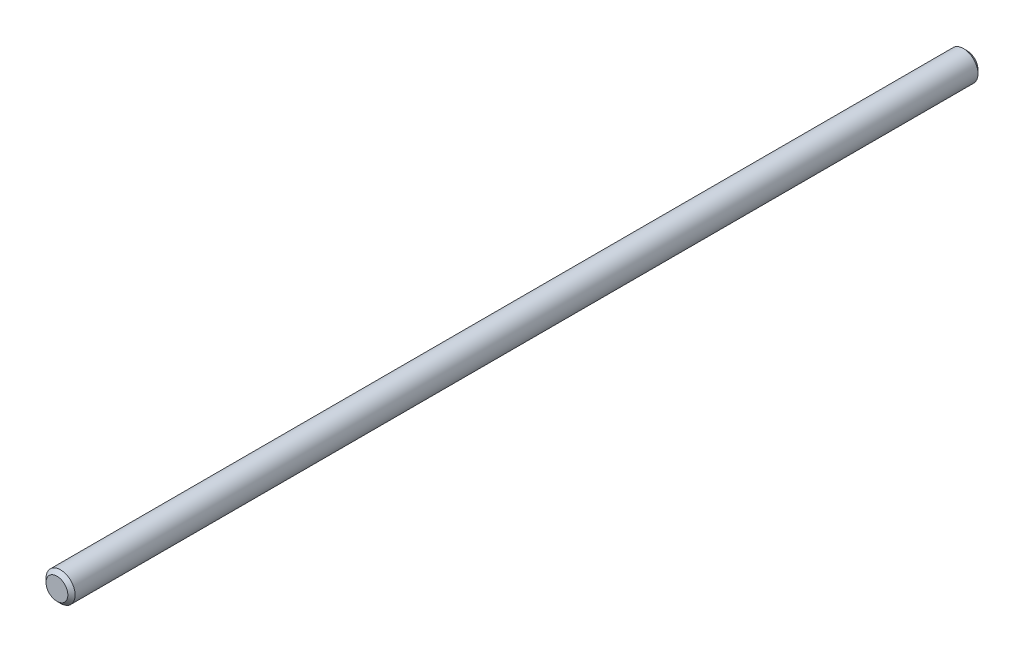
ISO-10303-21;
HEADER;
FILE_DESCRIPTION(('STEP AP214'),'2;1');
FILE_NAME('part.step','',(''),(''),'','','');
FILE_SCHEMA(('AUTOMOTIVE_DESIGN { 1 0 10303 214 1 1 1 1 }'));
ENDSEC;
DATA;
#1=APPLICATION_CONTEXT('core data for automotive mechanical design processes');
#2=APPLICATION_PROTOCOL_DEFINITION('international standard','automotive_design',2000,#1);
#3=PRODUCT_CONTEXT('',#1,'mechanical');
#4=PRODUCT('Part','Part','',(#3));
#5=PRODUCT_RELATED_PRODUCT_CATEGORY('part','',(#4));
#6=PRODUCT_DEFINITION_FORMATION('','',#4);
#7=PRODUCT_DEFINITION_CONTEXT('part definition',#1,'design');
#8=PRODUCT_DEFINITION('design','',#6,#7);
#9=PRODUCT_DEFINITION_SHAPE('','',#8);
#10=(LENGTH_UNIT() NAMED_UNIT(*) SI_UNIT(.MILLI.,.METRE.));
#11=(NAMED_UNIT(*) PLANE_ANGLE_UNIT() SI_UNIT($,.RADIAN.));
#12=(NAMED_UNIT(*) SI_UNIT($,.STERADIAN.) SOLID_ANGLE_UNIT());
#13=UNCERTAINTY_MEASURE_WITH_UNIT(LENGTH_MEASURE(1.E-05),#10,'distance_accuracy_value','');
#14=(GEOMETRIC_REPRESENTATION_CONTEXT(3) GLOBAL_UNCERTAINTY_ASSIGNED_CONTEXT((#13)) GLOBAL_UNIT_ASSIGNED_CONTEXT((#10,
#11,#12)) REPRESENTATION_CONTEXT('',''));
#15=CARTESIAN_POINT('',(0.,0.,0.));
#16=DIRECTION('',(0.,0.,1.));
#17=DIRECTION('',(1.,0.,0.));
#18=AXIS2_PLACEMENT_3D('',#15,#16,#17);
#19=CARTESIAN_POINT('',(0.,0.,125.));
#20=DIRECTION('',(0.,0.,-1.));
#21=DIRECTION('',(-1.,0.,0.));
#22=AXIS2_PLACEMENT_3D('',#19,#20,#21);
#23=CYLINDRICAL_SURFACE('',#22,4.);
#24=CARTESIAN_POINT('',(0.,0.,124.));
#25=DIRECTION('',(0.,0.,1.));
#26=DIRECTION('',(1.,0.,0.));
#27=AXIS2_PLACEMENT_3D('',#24,#25,#26);
#28=CIRCLE('',#27,4.);
#29=CARTESIAN_POINT('',(4.,0.,124.));
#30=VERTEX_POINT('',#29);
#31=EDGE_CURVE('E10',#30,#30,#28,.F.);
#32=ORIENTED_EDGE('',*,*,#31,.T.);
#33=EDGE_LOOP('',(#32));
#34=FACE_BOUND('',#33,.T.);
#35=CARTESIAN_POINT('',(0.,0.,-124.));
#36=DIRECTION('',(0.,0.,-1.));
#37=DIRECTION('',(-1.,0.,0.));
#38=AXIS2_PLACEMENT_3D('',#35,#36,#37);
#39=CIRCLE('',#38,4.);
#40=CARTESIAN_POINT('',(-4.,0.,-124.));
#41=VERTEX_POINT('',#40);
#42=EDGE_CURVE('E62',#41,#41,#39,.F.);
#43=ORIENTED_EDGE('',*,*,#42,.T.);
#44=EDGE_LOOP('',(#43));
#45=FACE_BOUND('',#44,.T.);
#46=ADVANCED_FACE('F47',(#34,#45),#23,.T.);
#47=CARTESIAN_POINT('',(0.,0.,125.));
#48=DIRECTION('',(0.,0.,1.));
#49=DIRECTION('',(1.,0.,0.));
#50=AXIS2_PLACEMENT_3D('',#47,#48,#49);
#51=PLANE('',#50);
#52=CARTESIAN_POINT('',(0.,0.,125.));
#53=DIRECTION('',(0.,0.,1.));
#54=DIRECTION('',(1.,0.,0.));
#55=AXIS2_PLACEMENT_3D('',#52,#53,#54);
#56=CIRCLE('',#55,2.99999999999998);
#57=CARTESIAN_POINT('',(2.99999999999998,0.,125.));
#58=VERTEX_POINT('',#57);
#59=EDGE_CURVE('E54',#58,#58,#56,.T.);
#60=ORIENTED_EDGE('',*,*,#59,.T.);
#61=EDGE_LOOP('',(#60));
#62=FACE_BOUND('',#61,.T.);
#63=ADVANCED_FACE('F79',(#62),#51,.T.);
#64=CARTESIAN_POINT('',(0.,0.,-125.));
#65=DIRECTION('',(0.,0.,-1.));
#66=DIRECTION('',(1.,0.,0.));
#67=AXIS2_PLACEMENT_3D('',#64,#65,#66);
#68=PLANE('',#67);
#69=CARTESIAN_POINT('',(0.,0.,-125.));
#70=DIRECTION('',(0.,0.,-1.));
#71=DIRECTION('',(-1.,0.,0.));
#72=AXIS2_PLACEMENT_3D('',#69,#70,#71);
#73=CIRCLE('',#72,2.99999999999998);
#74=CARTESIAN_POINT('',(-2.99999999999998,0.,-125.));
#75=VERTEX_POINT('',#74);
#76=EDGE_CURVE('E58',#75,#75,#73,.T.);
#77=ORIENTED_EDGE('',*,*,#76,.T.);
#78=EDGE_LOOP('',(#77));
#79=FACE_BOUND('',#78,.T.);
#80=ADVANCED_FACE('F71',(#79),#68,.T.);
#81=CARTESIAN_POINT('',(0.,0.,-124.));
#82=DIRECTION('',(0.,0.,1.));
#83=DIRECTION('',(1.,0.,0.));
#84=AXIS2_PLACEMENT_3D('',#81,#82,#83);
#85=CONICAL_SURFACE('',#84,4.,0.785398163397435);
#86=ORIENTED_EDGE('',*,*,#76,.F.);
#87=EDGE_LOOP('',(#86));
#88=FACE_BOUND('',#87,.T.);
#89=ORIENTED_EDGE('',*,*,#42,.F.);
#90=EDGE_LOOP('',(#89));
#91=FACE_BOUND('',#90,.T.);
#92=ADVANCED_FACE('F69',(#88,#91),#85,.T.);
#93=CARTESIAN_POINT('',(0.,0.,125.));
#94=DIRECTION('',(0.,0.,-1.));
#95=DIRECTION('',(-1.,0.,0.));
#96=AXIS2_PLACEMENT_3D('',#93,#94,#95);
#97=CONICAL_SURFACE('',#96,2.99999999999998,0.785398163397455);
#98=ORIENTED_EDGE('',*,*,#31,.F.);
#99=EDGE_LOOP('',(#98));
#100=FACE_BOUND('',#99,.T.);
#101=ORIENTED_EDGE('',*,*,#59,.F.);
#102=EDGE_LOOP('',(#101));
#103=FACE_BOUND('',#102,.T.);
#104=ADVANCED_FACE('F49',(#100,#103),#97,.T.);
#105=CLOSED_SHELL('',(#46,#63,#80,#92,#104));
#106=MANIFOLD_SOLID_BREP('B2',#105);
#107=ADVANCED_BREP_SHAPE_REPRESENTATION('',(#18,#106),#14);
#108=SHAPE_DEFINITION_REPRESENTATION(#9,#107);
ENDSEC;
END-ISO-10303-21;
